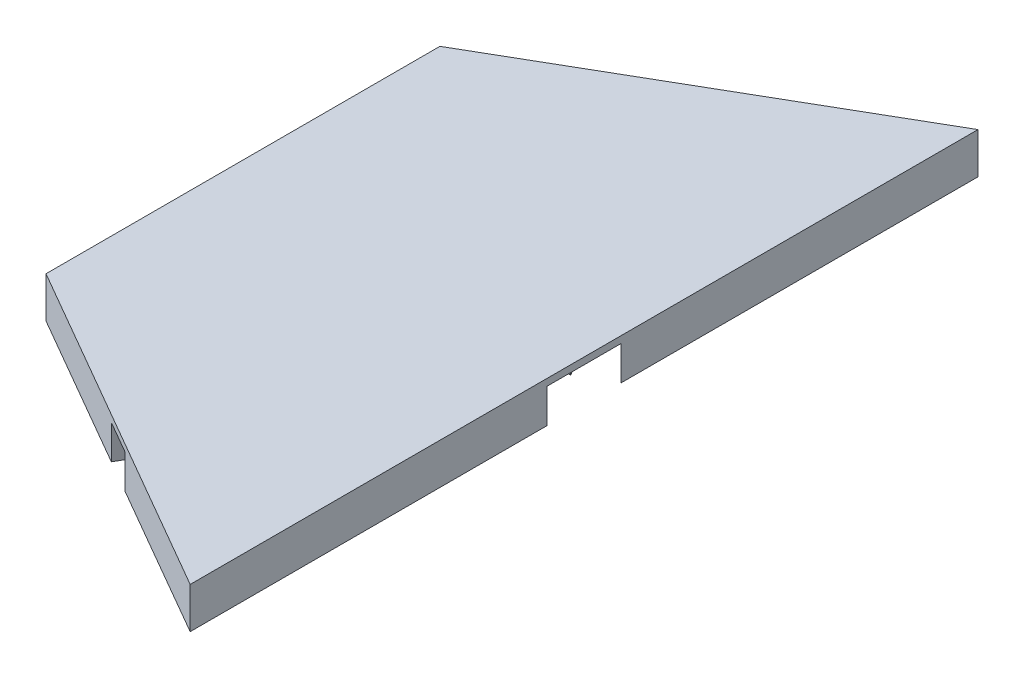
ISO-10303-21;
HEADER;
FILE_DESCRIPTION(('STEP AP214'),'2;1');
FILE_NAME('part.step','',(''),(''),'','','');
FILE_SCHEMA(('AUTOMOTIVE_DESIGN { 1 0 10303 214 1 1 1 1 }'));
ENDSEC;
DATA;
#1=APPLICATION_CONTEXT('core data for automotive mechanical design processes');
#2=APPLICATION_PROTOCOL_DEFINITION('international standard','automotive_design',2000,#1);
#3=PRODUCT_CONTEXT('',#1,'mechanical');
#4=PRODUCT('Part','Part','',(#3));
#5=PRODUCT_RELATED_PRODUCT_CATEGORY('part','',(#4));
#6=PRODUCT_DEFINITION_FORMATION('','',#4);
#7=PRODUCT_DEFINITION_CONTEXT('part definition',#1,'design');
#8=PRODUCT_DEFINITION('design','',#6,#7);
#9=PRODUCT_DEFINITION_SHAPE('','',#8);
#10=(LENGTH_UNIT() NAMED_UNIT(*) SI_UNIT(.MILLI.,.METRE.));
#11=(NAMED_UNIT(*) PLANE_ANGLE_UNIT() SI_UNIT($,.RADIAN.));
#12=(NAMED_UNIT(*) SI_UNIT($,.STERADIAN.) SOLID_ANGLE_UNIT());
#13=UNCERTAINTY_MEASURE_WITH_UNIT(LENGTH_MEASURE(1.E-05),#10,'distance_accuracy_value','');
#14=(GEOMETRIC_REPRESENTATION_CONTEXT(3) GLOBAL_UNCERTAINTY_ASSIGNED_CONTEXT((#13)) GLOBAL_UNIT_ASSIGNED_CONTEXT((#10,
#11,#12)) REPRESENTATION_CONTEXT('',''));
#15=CARTESIAN_POINT('',(0.,0.,0.));
#16=DIRECTION('',(0.,0.,1.));
#17=DIRECTION('',(1.,0.,0.));
#18=AXIS2_PLACEMENT_3D('',#15,#16,#17);
#19=CARTESIAN_POINT('',(0.,0.,0.));
#20=DIRECTION('',(1.,0.,0.));
#21=DIRECTION('',(0.,0.,-1.));
#22=AXIS2_PLACEMENT_3D('',#19,#20,#21);
#23=PLANE('',#22);
#24=DIRECTION('',(0.,1.,0.));
#25=VECTOR('',#24,1.);
#26=CARTESIAN_POINT('',(0.,5.,-5.4));
#27=LINE('',#26,#25);
#28=CARTESIAN_POINT('',(0.,0.,-5.39999999999999));
#29=VERTEX_POINT('',#28);
#30=CARTESIAN_POINT('',(0.,5.,-5.39999999999999));
#31=VERTEX_POINT('',#30);
#32=EDGE_CURVE('E229',#29,#31,#27,.T.);
#33=ORIENTED_EDGE('',*,*,#32,.F.);
#34=DIRECTION('',(0.,0.,-1.));
#35=VECTOR('',#34,1.);
#36=CARTESIAN_POINT('',(0.,0.,0.));
#37=LINE('',#36,#35);
#38=CARTESIAN_POINT('',(0.,0.,-57.7350269189626));
#39=VERTEX_POINT('',#38);
#40=EDGE_CURVE('E248',#29,#39,#37,.T.);
#41=ORIENTED_EDGE('',*,*,#40,.T.);
#42=DIRECTION('',(0.,-1.,0.));
#43=VECTOR('',#42,1.);
#44=CARTESIAN_POINT('',(0.,6.,-57.7350269189626));
#45=LINE('',#44,#43);
#46=CARTESIAN_POINT('',(0.,6.,-57.7350269189626));
#47=VERTEX_POINT('',#46);
#48=EDGE_CURVE('E256',#47,#39,#45,.T.);
#49=ORIENTED_EDGE('',*,*,#48,.F.);
#50=DIRECTION('',(0.,0.,-1.));
#51=VECTOR('',#50,1.);
#52=CARTESIAN_POINT('',(0.,6.,0.));
#53=LINE('',#52,#51);
#54=CARTESIAN_POINT('',(0.,6.,57.7350269189626));
#55=VERTEX_POINT('',#54);
#56=EDGE_CURVE('E247',#55,#47,#53,.T.);
#57=ORIENTED_EDGE('',*,*,#56,.F.);
#58=DIRECTION('',(0.,-1.,0.));
#59=VECTOR('',#58,1.);
#60=CARTESIAN_POINT('',(0.,6.,57.7350269189626));
#61=LINE('',#60,#59);
#62=CARTESIAN_POINT('',(0.,0.,57.7350269189626));
#63=VERTEX_POINT('',#62);
#64=EDGE_CURVE('E260',#55,#63,#61,.T.);
#65=ORIENTED_EDGE('',*,*,#64,.T.);
#66=DIRECTION('',(0.,0.,-1.));
#67=VECTOR('',#66,1.);
#68=CARTESIAN_POINT('',(0.,0.,0.));
#69=LINE('',#68,#67);
#70=CARTESIAN_POINT('',(0.,0.,5.40000000000001));
#71=VERTEX_POINT('',#70);
#72=EDGE_CURVE('E243',#63,#71,#69,.T.);
#73=ORIENTED_EDGE('',*,*,#72,.T.);
#74=DIRECTION('',(0.,1.,0.));
#75=VECTOR('',#74,1.);
#76=CARTESIAN_POINT('',(0.,5.,5.4));
#77=LINE('',#76,#75);
#78=CARTESIAN_POINT('',(0.,5.,5.40000000000001));
#79=VERTEX_POINT('',#78);
#80=EDGE_CURVE('E123',#71,#79,#77,.T.);
#81=ORIENTED_EDGE('',*,*,#80,.T.);
#82=DIRECTION('',(0.,0.,-1.));
#83=VECTOR('',#82,1.);
#84=CARTESIAN_POINT('',(0.,5.,0.));
#85=LINE('',#84,#83);
#86=EDGE_CURVE('E252',#79,#31,#85,.T.);
#87=ORIENTED_EDGE('',*,*,#86,.T.);
#88=EDGE_LOOP('',(#33,#41,#49,#57,#65,#73,#81,#87));
#89=FACE_BOUND('',#88,.T.);
#90=ADVANCED_FACE('F120',(#89),#23,.T.);
#91=CARTESIAN_POINT('',(0.,0.,0.));
#92=DIRECTION('',(0.,1.,0.));
#93=DIRECTION('',(0.,0.,1.));
#94=AXIS2_PLACEMENT_3D('',#91,#92,#93);
#95=PLANE('',#94);
#96=DIRECTION('',(-0.866025403784439,0.,0.5));
#97=VECTOR('',#96,1.);
#98=CARTESIAN_POINT('',(-25.,0.,-43.3012701892219));
#99=LINE('',#98,#97);
#100=CARTESIAN_POINT('',(-27.338268590218,0.,-41.951270189222));
#101=VERTEX_POINT('',#100);
#102=CARTESIAN_POINT('',(-50.,0.,-28.8675134594813));
#103=VERTEX_POINT('',#102);
#104=EDGE_CURVE('E291',#101,#103,#99,.T.);
#105=ORIENTED_EDGE('',*,*,#104,.F.);
#106=DIRECTION('',(-0.5,0.,-0.866025403784439));
#107=VECTOR('',#106,1.);
#108=CARTESIAN_POINT('',(22.661731409782,0.,44.6512701892219));
#109=LINE('',#108,#107);
#110=CARTESIAN_POINT('',(-4.67653718043598,0.,-2.7));
#111=VERTEX_POINT('',#110);
#112=EDGE_CURVE('E160',#111,#101,#109,.T.);
#113=ORIENTED_EDGE('',*,*,#112,.F.);
#114=DIRECTION('',(-1.,0.,0.));
#115=VECTOR('',#114,1.);
#116=CARTESIAN_POINT('',(50.,0.,-2.7));
#117=LINE('',#116,#115);
#118=CARTESIAN_POINT('',(-50.,0.,-2.7));
#119=VERTEX_POINT('',#118);
#120=EDGE_CURVE('E130',#111,#119,#117,.T.);
#121=ORIENTED_EDGE('',*,*,#120,.T.);
#122=DIRECTION('',(0.,0.,1.));
#123=VECTOR('',#122,1.);
#124=CARTESIAN_POINT('',(-50.,0.,0.));
#125=LINE('',#124,#123);
#126=EDGE_CURVE('E313',#103,#119,#125,.T.);
#127=ORIENTED_EDGE('',*,*,#126,.F.);
#128=EDGE_LOOP('',(#105,#113,#121,#127));
#129=FACE_BOUND('',#128,.T.);
#130=ADVANCED_FACE('F341',(#129),#95,.F.);
#131=DIRECTION('',(-1.,0.,0.));
#132=VECTOR('',#131,1.);
#133=CARTESIAN_POINT('',(50.,0.,2.7));
#134=LINE('',#133,#132);
#135=CARTESIAN_POINT('',(-4.67653718043598,0.,2.7));
#136=VERTEX_POINT('',#135);
#137=CARTESIAN_POINT('',(-50.,0.,2.7));
#138=VERTEX_POINT('',#137);
#139=EDGE_CURVE('E13',#136,#138,#134,.T.);
#140=ORIENTED_EDGE('',*,*,#139,.F.);
#141=DIRECTION('',(0.5,0.,-0.866025403784439));
#142=VECTOR('',#141,1.);
#143=CARTESIAN_POINT('',(-27.338268590218,0.,41.9512701892219));
#144=LINE('',#143,#142);
#145=CARTESIAN_POINT('',(-27.338268590218,0.,41.9512701892219));
#146=VERTEX_POINT('',#145);
#147=EDGE_CURVE('E226',#146,#136,#144,.T.);
#148=ORIENTED_EDGE('',*,*,#147,.F.);
#149=DIRECTION('',(0.866025403784439,0.,0.5));
#150=VECTOR('',#149,1.);
#151=CARTESIAN_POINT('',(-25.,0.,43.3012701892219));
#152=LINE('',#151,#150);
#153=CARTESIAN_POINT('',(-50.,0.,28.8675134594813));
#154=VERTEX_POINT('',#153);
#155=EDGE_CURVE('E299',#154,#146,#152,.T.);
#156=ORIENTED_EDGE('',*,*,#155,.F.);
#157=EDGE_CURVE('E312',#138,#154,#125,.T.);
#158=ORIENTED_EDGE('',*,*,#157,.F.);
#159=EDGE_LOOP('',(#140,#148,#156,#158));
#160=FACE_BOUND('',#159,.T.);
#161=ADVANCED_FACE('F398',(#160),#95,.F.);
#162=CARTESIAN_POINT('',(22.661731409782,5.,44.6512701892219));
#163=DIRECTION('',(-0.866025403784439,0.,0.5));
#164=DIRECTION('',(0.5,0.,0.866025403784439));
#165=AXIS2_PLACEMENT_3D('',#162,#163,#164);
#166=PLANE('',#165);
#167=ORIENTED_EDGE('',*,*,#112,.T.);
#168=DIRECTION('',(0.,-1.,0.));
#169=VECTOR('',#168,1.);
#170=CARTESIAN_POINT('',(-27.338268590218,5.,-41.951270189222));
#171=LINE('',#170,#169);
#172=CARTESIAN_POINT('',(-27.338268590218,5.,-41.951270189222));
#173=VERTEX_POINT('',#172);
#174=EDGE_CURVE('E182',#173,#101,#171,.T.);
#175=ORIENTED_EDGE('',*,*,#174,.F.);
#176=DIRECTION('',(-0.5,0.,-0.866025403784439));
#177=VECTOR('',#176,1.);
#178=CARTESIAN_POINT('',(22.661731409782,5.,44.6512701892219));
#179=LINE('',#178,#177);
#180=CARTESIAN_POINT('',(-4.67653718043598,5.,-2.7));
#181=VERTEX_POINT('',#180);
#182=EDGE_CURVE('E172',#181,#173,#179,.T.);
#183=ORIENTED_EDGE('',*,*,#182,.F.);
#184=DIRECTION('',(0.,1.,0.));
#185=VECTOR('',#184,1.);
#186=CARTESIAN_POINT('',(-4.67653718043597,5.,-2.7));
#187=LINE('',#186,#185);
#188=EDGE_CURVE('E199',#111,#181,#187,.T.);
#189=ORIENTED_EDGE('',*,*,#188,.F.);
#190=EDGE_LOOP('',(#167,#175,#183,#189));
#191=FACE_BOUND('',#190,.T.);
#192=ADVANCED_FACE('F183',(#191),#166,.F.);
#193=CARTESIAN_POINT('',(50.,5.,-2.7));
#194=DIRECTION('',(0.,0.,1.));
#195=DIRECTION('',(1.,0.,0.));
#196=AXIS2_PLACEMENT_3D('',#193,#194,#195);
#197=PLANE('',#196);
#198=ORIENTED_EDGE('',*,*,#188,.T.);
#199=DIRECTION('',(-1.,0.,0.));
#200=VECTOR('',#199,1.);
#201=CARTESIAN_POINT('',(50.,5.,-2.7));
#202=LINE('',#201,#200);
#203=CARTESIAN_POINT('',(-50.,5.,-2.7));
#204=VERTEX_POINT('',#203);
#205=EDGE_CURVE('E148',#181,#204,#202,.T.);
#206=ORIENTED_EDGE('',*,*,#205,.T.);
#207=DIRECTION('',(0.,-1.,0.));
#208=VECTOR('',#207,1.);
#209=CARTESIAN_POINT('',(-50.,5.,-2.7));
#210=LINE('',#209,#208);
#211=EDGE_CURVE('E202',#204,#119,#210,.T.);
#212=ORIENTED_EDGE('',*,*,#211,.T.);
#213=ORIENTED_EDGE('',*,*,#120,.F.);
#214=EDGE_LOOP('',(#198,#206,#212,#213));
#215=FACE_BOUND('',#214,.T.);
#216=ADVANCED_FACE('F346',(#215),#197,.T.);
#217=CARTESIAN_POINT('',(-50.,6.,0.));
#218=DIRECTION('',(1.,0.,0.));
#219=DIRECTION('',(0.,0.,-1.));
#220=AXIS2_PLACEMENT_3D('',#217,#218,#219);
#221=PLANE('',#220);
#222=DIRECTION('',(0.,0.,1.));
#223=VECTOR('',#222,1.);
#224=CARTESIAN_POINT('',(-50.,5.,-2.7));
#225=LINE('',#224,#223);
#226=CARTESIAN_POINT('',(-50.,5.,2.7));
#227=VERTEX_POINT('',#226);
#228=EDGE_CURVE('E208',#204,#227,#225,.T.);
#229=ORIENTED_EDGE('',*,*,#228,.T.);
#230=DIRECTION('',(0.,-1.,0.));
#231=VECTOR('',#230,1.);
#232=CARTESIAN_POINT('',(-50.,5.,2.7));
#233=LINE('',#232,#231);
#234=EDGE_CURVE('E203',#227,#138,#233,.T.);
#235=ORIENTED_EDGE('',*,*,#234,.T.);
#236=ORIENTED_EDGE('',*,*,#157,.T.);
#237=DIRECTION('',(0.,-1.,0.));
#238=VECTOR('',#237,1.);
#239=CARTESIAN_POINT('',(-50.,6.,28.8675134594813));
#240=LINE('',#239,#238);
#241=CARTESIAN_POINT('',(-50.,6.,28.8675134594813));
#242=VERTEX_POINT('',#241);
#243=EDGE_CURVE('E308',#242,#154,#240,.T.);
#244=ORIENTED_EDGE('',*,*,#243,.F.);
#245=DIRECTION('',(0.,0.,1.));
#246=VECTOR('',#245,1.);
#247=CARTESIAN_POINT('',(-50.,6.,0.));
#248=LINE('',#247,#246);
#249=CARTESIAN_POINT('',(-50.,6.,-28.8675134594813));
#250=VERTEX_POINT('',#249);
#251=EDGE_CURVE('E300',#250,#242,#248,.T.);
#252=ORIENTED_EDGE('',*,*,#251,.F.);
#253=DIRECTION('',(0.,-1.,0.));
#254=VECTOR('',#253,1.);
#255=CARTESIAN_POINT('',(-50.,6.,-28.8675134594813));
#256=LINE('',#255,#254);
#257=EDGE_CURVE('E264',#250,#103,#256,.T.);
#258=ORIENTED_EDGE('',*,*,#257,.T.);
#259=ORIENTED_EDGE('',*,*,#126,.T.);
#260=ORIENTED_EDGE('',*,*,#211,.F.);
#261=EDGE_LOOP('',(#229,#235,#236,#244,#252,#258,#259,#260));
#262=FACE_BOUND('',#261,.T.);
#263=ADVANCED_FACE('F331',(#262),#221,.F.);
#264=CARTESIAN_POINT('',(50.,5.,2.7));
#265=DIRECTION('',(0.,0.,1.));
#266=DIRECTION('',(1.,0.,0.));
#267=AXIS2_PLACEMENT_3D('',#264,#265,#266);
#268=PLANE('',#267);
#269=ORIENTED_EDGE('',*,*,#139,.T.);
#270=ORIENTED_EDGE('',*,*,#234,.F.);
#271=DIRECTION('',(-1.,0.,0.));
#272=VECTOR('',#271,1.);
#273=CARTESIAN_POINT('',(50.,5.,2.7));
#274=LINE('',#273,#272);
#275=CARTESIAN_POINT('',(-4.67653718043598,5.,2.7));
#276=VERTEX_POINT('',#275);
#277=EDGE_CURVE('E212',#276,#227,#274,.T.);
#278=ORIENTED_EDGE('',*,*,#277,.F.);
#279=DIRECTION('',(0.,1.,0.));
#280=VECTOR('',#279,1.);
#281=CARTESIAN_POINT('',(-4.67653718043598,5.,2.7));
#282=LINE('',#281,#280);
#283=EDGE_CURVE('E269',#136,#276,#282,.T.);
#284=ORIENTED_EDGE('',*,*,#283,.F.);
#285=EDGE_LOOP('',(#269,#270,#278,#284));
#286=FACE_BOUND('',#285,.T.);
#287=ADVANCED_FACE('F436',(#286),#268,.F.);
#288=CARTESIAN_POINT('',(-27.338268590218,5.,41.9512701892219));
#289=DIRECTION('',(-0.866025403784438,0.,-0.5));
#290=DIRECTION('',(-0.5,0.,0.866025403784438));
#291=AXIS2_PLACEMENT_3D('',#288,#289,#290);
#292=PLANE('',#291);
#293=ORIENTED_EDGE('',*,*,#283,.T.);
#294=DIRECTION('',(0.5,0.,-0.866025403784439));
#295=VECTOR('',#294,1.);
#296=CARTESIAN_POINT('',(-27.338268590218,5.,41.9512701892219));
#297=LINE('',#296,#295);
#298=CARTESIAN_POINT('',(-27.338268590218,5.,41.9512701892219));
#299=VERTEX_POINT('',#298);
#300=EDGE_CURVE('E217',#299,#276,#297,.T.);
#301=ORIENTED_EDGE('',*,*,#300,.F.);
#302=DIRECTION('',(0.,-1.,0.));
#303=VECTOR('',#302,1.);
#304=CARTESIAN_POINT('',(-27.338268590218,5.,41.9512701892219));
#305=LINE('',#304,#303);
#306=EDGE_CURVE('E287',#299,#146,#305,.T.);
#307=ORIENTED_EDGE('',*,*,#306,.T.);
#308=ORIENTED_EDGE('',*,*,#147,.T.);
#309=EDGE_LOOP('',(#293,#301,#307,#308));
#310=FACE_BOUND('',#309,.T.);
#311=ADVANCED_FACE('F396',(#310),#292,.F.);
#312=ORIENTED_EDGE('',*,*,#40,.F.);
#313=DIRECTION('',(-0.5,0.,-0.866025403784439));
#314=VECTOR('',#313,1.);
#315=CARTESIAN_POINT('',(27.338268590218,0.,41.9512701892219));
#316=LINE('',#315,#314);
#317=CARTESIAN_POINT('',(-22.661731409782,0.,-44.651270189222));
#318=VERTEX_POINT('',#317);
#319=EDGE_CURVE('E180',#29,#318,#316,.T.);
#320=ORIENTED_EDGE('',*,*,#319,.T.);
#321=EDGE_CURVE('E309',#39,#318,#99,.T.);
#322=ORIENTED_EDGE('',*,*,#321,.F.);
#323=EDGE_LOOP('',(#312,#320,#322));
#324=FACE_BOUND('',#323,.T.);
#325=ADVANCED_FACE('F383',(#324),#95,.F.);
#326=CARTESIAN_POINT('',(-25.,6.,-43.3012701892219));
#327=DIRECTION('',(0.5,0.,0.866025403784439));
#328=DIRECTION('',(0.866025403784439,0.,-0.5));
#329=AXIS2_PLACEMENT_3D('',#326,#327,#328);
#330=PLANE('',#329);
#331=DIRECTION('',(-0.866025403784439,0.,0.499999999999999));
#332=VECTOR('',#331,1.);
#333=CARTESIAN_POINT('',(-22.661731409782,5.,-44.651270189222));
#334=LINE('',#333,#332);
#335=CARTESIAN_POINT('',(-22.661731409782,5.,-44.651270189222));
#336=VERTEX_POINT('',#335);
#337=EDGE_CURVE('E177',#336,#173,#334,.T.);
#338=ORIENTED_EDGE('',*,*,#337,.T.);
#339=ORIENTED_EDGE('',*,*,#174,.T.);
#340=ORIENTED_EDGE('',*,*,#104,.T.);
#341=ORIENTED_EDGE('',*,*,#257,.F.);
#342=DIRECTION('',(-0.866025403784439,0.,0.5));
#343=VECTOR('',#342,1.);
#344=CARTESIAN_POINT('',(-25.,6.,-43.3012701892219));
#345=LINE('',#344,#343);
#346=EDGE_CURVE('E295',#47,#250,#345,.T.);
#347=ORIENTED_EDGE('',*,*,#346,.F.);
#348=ORIENTED_EDGE('',*,*,#48,.T.);
#349=ORIENTED_EDGE('',*,*,#321,.T.);
#350=DIRECTION('',(0.,-1.,0.));
#351=VECTOR('',#350,1.);
#352=CARTESIAN_POINT('',(-22.661731409782,5.,-44.651270189222));
#353=LINE('',#352,#351);
#354=EDGE_CURVE('E189',#336,#318,#353,.T.);
#355=ORIENTED_EDGE('',*,*,#354,.F.);
#356=EDGE_LOOP('',(#338,#339,#340,#341,#347,#348,#349,#355));
#357=FACE_BOUND('',#356,.T.);
#358=ADVANCED_FACE('F191',(#357),#330,.F.);
#359=CARTESIAN_POINT('',(0.,5.,0.));
#360=DIRECTION('',(0.,1.,0.));
#361=DIRECTION('',(-1.,0.,0.));
#362=AXIS2_PLACEMENT_3D('',#359,#360,#361);
#363=PLANE('',#362);
#364=ORIENTED_EDGE('',*,*,#86,.F.);
#365=DIRECTION('',(0.5,0.,-0.866025403784439));
#366=VECTOR('',#365,1.);
#367=CARTESIAN_POINT('',(-22.661731409782,5.,44.6512701892219));
#368=LINE('',#367,#366);
#369=CARTESIAN_POINT('',(-22.661731409782,5.,44.6512701892219));
#370=VERTEX_POINT('',#369);
#371=EDGE_CURVE('E213',#370,#79,#368,.T.);
#372=ORIENTED_EDGE('',*,*,#371,.F.);
#373=DIRECTION('',(0.866025403784438,0.,0.500000000000001));
#374=VECTOR('',#373,1.);
#375=CARTESIAN_POINT('',(-27.338268590218,5.,41.9512701892219));
#376=LINE('',#375,#374);
#377=EDGE_CURVE('E218',#299,#370,#376,.T.);
#378=ORIENTED_EDGE('',*,*,#377,.F.);
#379=ORIENTED_EDGE('',*,*,#300,.T.);
#380=ORIENTED_EDGE('',*,*,#277,.T.);
#381=ORIENTED_EDGE('',*,*,#228,.F.);
#382=ORIENTED_EDGE('',*,*,#205,.F.);
#383=ORIENTED_EDGE('',*,*,#182,.T.);
#384=ORIENTED_EDGE('',*,*,#337,.F.);
#385=DIRECTION('',(-0.5,0.,-0.866025403784439));
#386=VECTOR('',#385,1.);
#387=CARTESIAN_POINT('',(27.338268590218,5.,41.9512701892219));
#388=LINE('',#387,#386);
#389=EDGE_CURVE('E188',#31,#336,#388,.T.);
#390=ORIENTED_EDGE('',*,*,#389,.F.);
#391=EDGE_LOOP('',(#364,#372,#378,#379,#380,#381,#382,#383,#384,#390));
#392=FACE_BOUND('',#391,.T.);
#393=ADVANCED_FACE('F174',(#392),#363,.F.);
#394=CARTESIAN_POINT('',(27.338268590218,5.,41.9512701892219));
#395=DIRECTION('',(-0.866025403784439,0.,0.5));
#396=DIRECTION('',(0.5,0.,0.866025403784439));
#397=AXIS2_PLACEMENT_3D('',#394,#395,#396);
#398=PLANE('',#397);
#399=ORIENTED_EDGE('',*,*,#32,.T.);
#400=ORIENTED_EDGE('',*,*,#389,.T.);
#401=ORIENTED_EDGE('',*,*,#354,.T.);
#402=ORIENTED_EDGE('',*,*,#319,.F.);
#403=EDGE_LOOP('',(#399,#400,#401,#402));
#404=FACE_BOUND('',#403,.T.);
#405=ADVANCED_FACE('F381',(#404),#398,.T.);
#406=CARTESIAN_POINT('',(-25.,6.,43.3012701892219));
#407=DIRECTION('',(0.5,0.,-0.866025403784438));
#408=DIRECTION('',(-0.866025403784439,0.,-0.5));
#409=AXIS2_PLACEMENT_3D('',#406,#407,#408);
#410=PLANE('',#409);
#411=ORIENTED_EDGE('',*,*,#155,.T.);
#412=ORIENTED_EDGE('',*,*,#306,.F.);
#413=ORIENTED_EDGE('',*,*,#377,.T.);
#414=DIRECTION('',(0.,-1.,0.));
#415=VECTOR('',#414,1.);
#416=CARTESIAN_POINT('',(-22.661731409782,5.,44.6512701892219));
#417=LINE('',#416,#415);
#418=CARTESIAN_POINT('',(-22.661731409782,0.,44.6512701892219));
#419=VERTEX_POINT('',#418);
#420=EDGE_CURVE('E286',#370,#419,#417,.T.);
#421=ORIENTED_EDGE('',*,*,#420,.T.);
#422=EDGE_CURVE('E317',#419,#63,#152,.T.);
#423=ORIENTED_EDGE('',*,*,#422,.T.);
#424=ORIENTED_EDGE('',*,*,#64,.F.);
#425=DIRECTION('',(0.866025403784439,0.,0.5));
#426=VECTOR('',#425,1.);
#427=CARTESIAN_POINT('',(-25.,6.,43.3012701892219));
#428=LINE('',#427,#426);
#429=EDGE_CURVE('E304',#242,#55,#428,.T.);
#430=ORIENTED_EDGE('',*,*,#429,.F.);
#431=ORIENTED_EDGE('',*,*,#243,.T.);
#432=EDGE_LOOP('',(#411,#412,#413,#421,#423,#424,#430,#431));
#433=FACE_BOUND('',#432,.T.);
#434=ADVANCED_FACE('F392',(#433),#410,.F.);
#435=ORIENTED_EDGE('',*,*,#72,.F.);
#436=ORIENTED_EDGE('',*,*,#422,.F.);
#437=DIRECTION('',(0.5,0.,-0.866025403784439));
#438=VECTOR('',#437,1.);
#439=CARTESIAN_POINT('',(-22.661731409782,0.,44.6512701892219));
#440=LINE('',#439,#438);
#441=EDGE_CURVE('E222',#419,#71,#440,.T.);
#442=ORIENTED_EDGE('',*,*,#441,.T.);
#443=EDGE_LOOP('',(#435,#436,#442));
#444=FACE_BOUND('',#443,.T.);
#445=ADVANCED_FACE('F407',(#444),#95,.F.);
#446=CARTESIAN_POINT('',(-22.661731409782,5.,44.6512701892219));
#447=DIRECTION('',(-0.866025403784438,0.,-0.5));
#448=DIRECTION('',(-0.5,0.,0.866025403784438));
#449=AXIS2_PLACEMENT_3D('',#446,#447,#448);
#450=PLANE('',#449);
#451=ORIENTED_EDGE('',*,*,#441,.F.);
#452=ORIENTED_EDGE('',*,*,#420,.F.);
#453=ORIENTED_EDGE('',*,*,#371,.T.);
#454=ORIENTED_EDGE('',*,*,#80,.F.);
#455=EDGE_LOOP('',(#451,#452,#453,#454));
#456=FACE_BOUND('',#455,.T.);
#457=ADVANCED_FACE('F412',(#456),#450,.T.);
#458=CARTESIAN_POINT('',(0.,6.,0.));
#459=DIRECTION('',(0.,1.,0.));
#460=DIRECTION('',(0.,0.,1.));
#461=AXIS2_PLACEMENT_3D('',#458,#459,#460);
#462=PLANE('',#461);
#463=ORIENTED_EDGE('',*,*,#429,.T.);
#464=ORIENTED_EDGE('',*,*,#56,.T.);
#465=ORIENTED_EDGE('',*,*,#346,.T.);
#466=ORIENTED_EDGE('',*,*,#251,.T.);
#467=EDGE_LOOP('',(#463,#464,#465,#466));
#468=FACE_BOUND('',#467,.T.);
#469=ADVANCED_FACE('F410',(#468),#462,.T.);
#470=CLOSED_SHELL('',(#90,#130,#161,#192,#216,#263,#287,#311,#325,#358,#393,#405,#434,#445,#457,#469));
#471=MANIFOLD_SOLID_BREP('B2',#470);
#472=ADVANCED_BREP_SHAPE_REPRESENTATION('',(#18,#471),#14);
#473=SHAPE_DEFINITION_REPRESENTATION(#9,#472);
ENDSEC;
END-ISO-10303-21;
